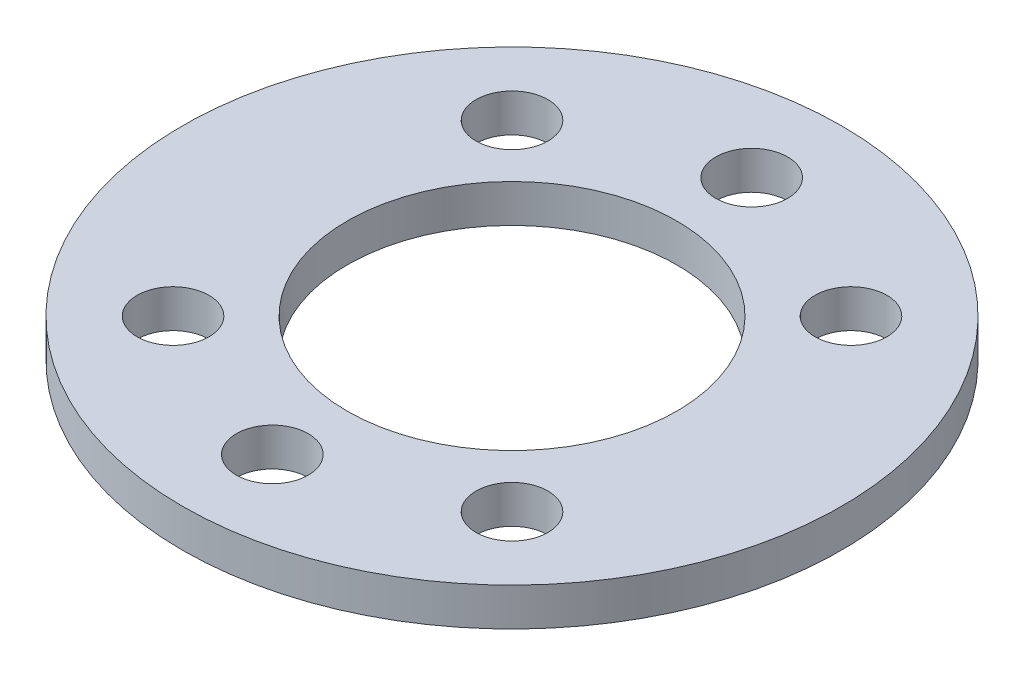
ISO-10303-21;
HEADER;
FILE_DESCRIPTION(('STEP AP214'),'2;1');
FILE_NAME('part.step','',(''),(''),'','','');
FILE_SCHEMA(('AUTOMOTIVE_DESIGN { 1 0 10303 214 1 1 1 1 }'));
ENDSEC;
DATA;
#1=APPLICATION_CONTEXT('core data for automotive mechanical design processes');
#2=APPLICATION_PROTOCOL_DEFINITION('international standard','automotive_design',2000,#1);
#3=PRODUCT_CONTEXT('',#1,'mechanical');
#4=PRODUCT('Part','Part','',(#3));
#5=PRODUCT_RELATED_PRODUCT_CATEGORY('part','',(#4));
#6=PRODUCT_DEFINITION_FORMATION('','',#4);
#7=PRODUCT_DEFINITION_CONTEXT('part definition',#1,'design');
#8=PRODUCT_DEFINITION('design','',#6,#7);
#9=PRODUCT_DEFINITION_SHAPE('','',#8);
#10=(LENGTH_UNIT() NAMED_UNIT(*) SI_UNIT(.MILLI.,.METRE.));
#11=(NAMED_UNIT(*) PLANE_ANGLE_UNIT() SI_UNIT($,.RADIAN.));
#12=(NAMED_UNIT(*) SI_UNIT($,.STERADIAN.) SOLID_ANGLE_UNIT());
#13=UNCERTAINTY_MEASURE_WITH_UNIT(LENGTH_MEASURE(1.E-05),#10,'distance_accuracy_value','');
#14=(GEOMETRIC_REPRESENTATION_CONTEXT(3) GLOBAL_UNCERTAINTY_ASSIGNED_CONTEXT((#13)) GLOBAL_UNIT_ASSIGNED_CONTEXT((#10,
#11,#12)) REPRESENTATION_CONTEXT('',''));
#15=CARTESIAN_POINT('',(0.,0.,0.));
#16=DIRECTION('',(0.,0.,1.));
#17=DIRECTION('',(1.,0.,0.));
#18=AXIS2_PLACEMENT_3D('',#15,#16,#17);
#19=CARTESIAN_POINT('',(0.,2.54,0.));
#20=DIRECTION('',(0.,-1.,0.));
#21=DIRECTION('',(0.,0.,-1.));
#22=AXIS2_PLACEMENT_3D('',#19,#20,#21);
#23=CYLINDRICAL_SURFACE('',#22,11.);
#24=CARTESIAN_POINT('',(0.,2.54,0.));
#25=DIRECTION('',(0.,1.,0.));
#26=DIRECTION('',(0.,0.,1.));
#27=AXIS2_PLACEMENT_3D('',#24,#25,#26);
#28=CIRCLE('',#27,11.);
#29=CARTESIAN_POINT('',(0.,2.54,11.));
#30=VERTEX_POINT('',#29);
#31=EDGE_CURVE('E47',#30,#30,#28,.T.);
#32=ORIENTED_EDGE('',*,*,#31,.T.);
#33=EDGE_LOOP('',(#32));
#34=FACE_BOUND('',#33,.T.);
#35=CARTESIAN_POINT('',(0.,0.,0.));
#36=DIRECTION('',(0.,1.,0.));
#37=DIRECTION('',(0.,0.,1.));
#38=AXIS2_PLACEMENT_3D('',#35,#36,#37);
#39=CIRCLE('',#38,11.);
#40=CARTESIAN_POINT('',(0.,0.,11.));
#41=VERTEX_POINT('',#40);
#42=EDGE_CURVE('E57',#41,#41,#39,.T.);
#43=ORIENTED_EDGE('',*,*,#42,.F.);
#44=EDGE_LOOP('',(#43));
#45=FACE_BOUND('',#44,.T.);
#46=ADVANCED_FACE('F39',(#34,#45),#23,.F.);
#47=CARTESIAN_POINT('',(0.,2.54,0.));
#48=DIRECTION('',(0.,-1.,0.));
#49=DIRECTION('',(0.,0.,-1.));
#50=AXIS2_PLACEMENT_3D('',#47,#48,#49);
#51=CYLINDRICAL_SURFACE('',#50,22.);
#52=CARTESIAN_POINT('',(0.,2.54,0.));
#53=DIRECTION('',(0.,1.,0.));
#54=DIRECTION('',(0.,0.,1.));
#55=AXIS2_PLACEMENT_3D('',#52,#53,#54);
#56=CIRCLE('',#55,22.);
#57=CARTESIAN_POINT('',(0.,2.54,22.));
#58=VERTEX_POINT('',#57);
#59=EDGE_CURVE('E10',#58,#58,#56,.T.);
#60=ORIENTED_EDGE('',*,*,#59,.F.);
#61=EDGE_LOOP('',(#60));
#62=FACE_BOUND('',#61,.T.);
#63=CARTESIAN_POINT('',(0.,0.,0.));
#64=DIRECTION('',(0.,1.,0.));
#65=DIRECTION('',(0.,0.,1.));
#66=AXIS2_PLACEMENT_3D('',#63,#64,#65);
#67=CIRCLE('',#66,22.);
#68=CARTESIAN_POINT('',(0.,0.,22.));
#69=VERTEX_POINT('',#68);
#70=EDGE_CURVE('E53',#69,#69,#67,.T.);
#71=ORIENTED_EDGE('',*,*,#70,.T.);
#72=EDGE_LOOP('',(#71));
#73=FACE_BOUND('',#72,.T.);
#74=ADVANCED_FACE('F105',(#62,#73),#51,.T.);
#75=CARTESIAN_POINT('',(0.,2.54,0.));
#76=DIRECTION('',(0.,1.,0.));
#77=DIRECTION('',(0.,0.,1.));
#78=AXIS2_PLACEMENT_3D('',#75,#76,#77);
#79=PLANE('',#78);
#80=CARTESIAN_POINT('',(-11.3137084989823,2.54,11.3137084989821));
#81=DIRECTION('',(0.,1.,0.));
#82=DIRECTION('',(0.,0.,1.));
#83=AXIS2_PLACEMENT_3D('',#80,#81,#82);
#84=CIRCLE('',#83,2.4000000000032);
#85=CARTESIAN_POINT('',(-11.3137084989823,2.54,13.7137084989853));
#86=VERTEX_POINT('',#85);
#87=EDGE_CURVE('E134',#86,#86,#84,.T.);
#88=ORIENTED_EDGE('',*,*,#87,.F.);
#89=EDGE_LOOP('',(#88));
#90=FACE_BOUND('',#89,.T.);
#91=CARTESIAN_POINT('',(2.44827502489348E-12,2.54,15.9999999999974));
#92=DIRECTION('',(0.,1.,0.));
#93=DIRECTION('',(0.,0.,1.));
#94=AXIS2_PLACEMENT_3D('',#91,#92,#93);
#95=CIRCLE('',#94,2.4000000000032);
#96=CARTESIAN_POINT('',(2.44827502489348E-12,2.54,18.4000000000006));
#97=VERTEX_POINT('',#96);
#98=EDGE_CURVE('E138',#97,#97,#95,.T.);
#99=ORIENTED_EDGE('',*,*,#98,.F.);
#100=EDGE_LOOP('',(#99));
#101=FACE_BOUND('',#100,.T.);
#102=CARTESIAN_POINT('',(11.3137084989873,2.54,11.3137084989823));
#103=DIRECTION('',(0.,1.,0.));
#104=DIRECTION('',(0.,0.,1.));
#105=AXIS2_PLACEMENT_3D('',#102,#103,#104);
#106=CIRCLE('',#105,2.4000000000032);
#107=CARTESIAN_POINT('',(11.3137084989873,2.54,13.7137084989855));
#108=VERTEX_POINT('',#107);
#109=EDGE_CURVE('E142',#108,#108,#106,.T.);
#110=ORIENTED_EDGE('',*,*,#109,.F.);
#111=EDGE_LOOP('',(#110));
#112=FACE_BOUND('',#111,.T.);
#113=CARTESIAN_POINT('',(11.3137084989848,2.54,-11.3137084989847));
#114=DIRECTION('',(0.,1.,0.));
#115=DIRECTION('',(0.,0.,1.));
#116=AXIS2_PLACEMENT_3D('',#113,#114,#115);
#117=CIRCLE('',#116,2.4);
#118=CARTESIAN_POINT('',(11.3137084989848,2.54,-8.91370849898474));
#119=VERTEX_POINT('',#118);
#120=EDGE_CURVE('E146',#119,#119,#117,.T.);
#121=ORIENTED_EDGE('',*,*,#120,.F.);
#122=EDGE_LOOP('',(#121));
#123=FACE_BOUND('',#122,.T.);
#124=CARTESIAN_POINT('',(0.,2.54,-16.));
#125=DIRECTION('',(0.,1.,0.));
#126=DIRECTION('',(0.,0.,1.));
#127=AXIS2_PLACEMENT_3D('',#124,#125,#126);
#128=CIRCLE('',#127,2.4);
#129=CARTESIAN_POINT('',(0.,2.54,-13.6));
#130=VERTEX_POINT('',#129);
#131=EDGE_CURVE('E150',#130,#130,#128,.T.);
#132=ORIENTED_EDGE('',*,*,#131,.F.);
#133=EDGE_LOOP('',(#132));
#134=FACE_BOUND('',#133,.T.);
#135=CARTESIAN_POINT('',(-11.3137084989848,2.54,-11.3137084989847));
#136=DIRECTION('',(0.,1.,0.));
#137=DIRECTION('',(0.,0.,1.));
#138=AXIS2_PLACEMENT_3D('',#135,#136,#137);
#139=CIRCLE('',#138,2.4);
#140=CARTESIAN_POINT('',(-11.3137084989848,2.54,-8.91370849898474));
#141=VERTEX_POINT('',#140);
#142=EDGE_CURVE('E69',#141,#141,#139,.T.);
#143=ORIENTED_EDGE('',*,*,#142,.F.);
#144=EDGE_LOOP('',(#143));
#145=FACE_BOUND('',#144,.T.);
#146=ORIENTED_EDGE('',*,*,#31,.F.);
#147=EDGE_LOOP('',(#146));
#148=FACE_BOUND('',#147,.T.);
#149=ORIENTED_EDGE('',*,*,#59,.T.);
#150=EDGE_LOOP('',(#149));
#151=FACE_BOUND('',#150,.T.);
#152=ADVANCED_FACE('F110',(#90,#101,#112,#123,#134,#145,#148,#151),#79,.T.);
#153=CARTESIAN_POINT('',(0.,0.,0.));
#154=DIRECTION('',(0.,1.,0.));
#155=DIRECTION('',(0.,0.,1.));
#156=AXIS2_PLACEMENT_3D('',#153,#154,#155);
#157=PLANE('',#156);
#158=CARTESIAN_POINT('',(-11.3137084989823,0.,11.3137084989821));
#159=DIRECTION('',(0.,1.,0.));
#160=DIRECTION('',(0.,0.,1.));
#161=AXIS2_PLACEMENT_3D('',#158,#159,#160);
#162=CIRCLE('',#161,2.4000000000032);
#163=CARTESIAN_POINT('',(-11.3137084989823,0.,13.7137084989853));
#164=VERTEX_POINT('',#163);
#165=EDGE_CURVE('E42',#164,#164,#162,.T.);
#166=ORIENTED_EDGE('',*,*,#165,.T.);
#167=EDGE_LOOP('',(#166));
#168=FACE_BOUND('',#167,.T.);
#169=CARTESIAN_POINT('',(2.44827502489348E-12,0.,15.9999999999974));
#170=DIRECTION('',(0.,1.,0.));
#171=DIRECTION('',(0.,0.,1.));
#172=AXIS2_PLACEMENT_3D('',#169,#170,#171);
#173=CIRCLE('',#172,2.4000000000032);
#174=CARTESIAN_POINT('',(2.44827502489348E-12,0.,18.4000000000006));
#175=VERTEX_POINT('',#174);
#176=EDGE_CURVE('E80',#175,#175,#173,.T.);
#177=ORIENTED_EDGE('',*,*,#176,.T.);
#178=EDGE_LOOP('',(#177));
#179=FACE_BOUND('',#178,.T.);
#180=CARTESIAN_POINT('',(11.3137084989873,0.,11.3137084989823));
#181=DIRECTION('',(0.,1.,0.));
#182=DIRECTION('',(0.,0.,1.));
#183=AXIS2_PLACEMENT_3D('',#180,#181,#182);
#184=CIRCLE('',#183,2.4000000000032);
#185=CARTESIAN_POINT('',(11.3137084989873,0.,13.7137084989855));
#186=VERTEX_POINT('',#185);
#187=EDGE_CURVE('E77',#186,#186,#184,.T.);
#188=ORIENTED_EDGE('',*,*,#187,.T.);
#189=EDGE_LOOP('',(#188));
#190=FACE_BOUND('',#189,.T.);
#191=CARTESIAN_POINT('',(11.3137084989848,0.,-11.3137084989847));
#192=DIRECTION('',(0.,1.,0.));
#193=DIRECTION('',(0.,0.,1.));
#194=AXIS2_PLACEMENT_3D('',#191,#192,#193);
#195=CIRCLE('',#194,2.4);
#196=CARTESIAN_POINT('',(11.3137084989848,0.,-8.91370849898474));
#197=VERTEX_POINT('',#196);
#198=EDGE_CURVE('E73',#197,#197,#195,.T.);
#199=ORIENTED_EDGE('',*,*,#198,.T.);
#200=EDGE_LOOP('',(#199));
#201=FACE_BOUND('',#200,.T.);
#202=CARTESIAN_POINT('',(0.,0.,-16.));
#203=DIRECTION('',(0.,1.,0.));
#204=DIRECTION('',(0.,0.,1.));
#205=AXIS2_PLACEMENT_3D('',#202,#203,#204);
#206=CIRCLE('',#205,2.4);
#207=CARTESIAN_POINT('',(0.,0.,-13.6));
#208=VERTEX_POINT('',#207);
#209=EDGE_CURVE('E68',#208,#208,#206,.T.);
#210=ORIENTED_EDGE('',*,*,#209,.T.);
#211=EDGE_LOOP('',(#210));
#212=FACE_BOUND('',#211,.T.);
#213=CARTESIAN_POINT('',(-11.3137084989848,0.,-11.3137084989847));
#214=DIRECTION('',(0.,1.,0.));
#215=DIRECTION('',(0.,0.,1.));
#216=AXIS2_PLACEMENT_3D('',#213,#214,#215);
#217=CIRCLE('',#216,2.4);
#218=CARTESIAN_POINT('',(-11.3137084989848,0.,-8.91370849898474));
#219=VERTEX_POINT('',#218);
#220=EDGE_CURVE('E64',#219,#219,#217,.T.);
#221=ORIENTED_EDGE('',*,*,#220,.T.);
#222=EDGE_LOOP('',(#221));
#223=FACE_BOUND('',#222,.T.);
#224=ORIENTED_EDGE('',*,*,#42,.T.);
#225=EDGE_LOOP('',(#224));
#226=FACE_BOUND('',#225,.T.);
#227=ORIENTED_EDGE('',*,*,#70,.F.);
#228=EDGE_LOOP('',(#227));
#229=FACE_BOUND('',#228,.T.);
#230=ADVANCED_FACE('F89',(#168,#179,#190,#201,#212,#223,#226,#229),#157,.F.);
#231=CARTESIAN_POINT('',(-11.3137084989848,-7.46,-11.3137084989847));
#232=DIRECTION('',(0.,1.,0.));
#233=DIRECTION('',(0.,0.,1.));
#234=AXIS2_PLACEMENT_3D('',#231,#232,#233);
#235=CYLINDRICAL_SURFACE('',#234,2.4);
#236=ORIENTED_EDGE('',*,*,#142,.T.);
#237=EDGE_LOOP('',(#236));
#238=FACE_BOUND('',#237,.T.);
#239=ORIENTED_EDGE('',*,*,#220,.F.);
#240=EDGE_LOOP('',(#239));
#241=FACE_BOUND('',#240,.T.);
#242=ADVANCED_FACE('F118',(#238,#241),#235,.F.);
#243=CARTESIAN_POINT('',(0.,-7.46,-16.));
#244=DIRECTION('',(0.,1.,0.));
#245=DIRECTION('',(0.,0.,1.));
#246=AXIS2_PLACEMENT_3D('',#243,#244,#245);
#247=CYLINDRICAL_SURFACE('',#246,2.4);
#248=ORIENTED_EDGE('',*,*,#131,.T.);
#249=EDGE_LOOP('',(#248));
#250=FACE_BOUND('',#249,.T.);
#251=ORIENTED_EDGE('',*,*,#209,.F.);
#252=EDGE_LOOP('',(#251));
#253=FACE_BOUND('',#252,.T.);
#254=ADVANCED_FACE('F126',(#250,#253),#247,.F.);
#255=CARTESIAN_POINT('',(11.3137084989848,-7.46,-11.3137084989847));
#256=DIRECTION('',(0.,1.,0.));
#257=DIRECTION('',(0.,0.,1.));
#258=AXIS2_PLACEMENT_3D('',#255,#256,#257);
#259=CYLINDRICAL_SURFACE('',#258,2.4);
#260=ORIENTED_EDGE('',*,*,#120,.T.);
#261=EDGE_LOOP('',(#260));
#262=FACE_BOUND('',#261,.T.);
#263=ORIENTED_EDGE('',*,*,#198,.F.);
#264=EDGE_LOOP('',(#263));
#265=FACE_BOUND('',#264,.T.);
#266=ADVANCED_FACE('F166',(#262,#265),#259,.F.);
#267=CARTESIAN_POINT('',(11.3137084989873,-7.46,11.3137084989823));
#268=DIRECTION('',(0.,1.,0.));
#269=DIRECTION('',(0.,0.,1.));
#270=AXIS2_PLACEMENT_3D('',#267,#268,#269);
#271=CYLINDRICAL_SURFACE('',#270,2.4000000000032);
#272=ORIENTED_EDGE('',*,*,#109,.T.);
#273=EDGE_LOOP('',(#272));
#274=FACE_BOUND('',#273,.T.);
#275=ORIENTED_EDGE('',*,*,#187,.F.);
#276=EDGE_LOOP('',(#275));
#277=FACE_BOUND('',#276,.T.);
#278=ADVANCED_FACE('F99',(#274,#277),#271,.F.);
#279=CARTESIAN_POINT('',(2.44827502489348E-12,-7.46,15.9999999999974));
#280=DIRECTION('',(0.,1.,0.));
#281=DIRECTION('',(0.,0.,1.));
#282=AXIS2_PLACEMENT_3D('',#279,#280,#281);
#283=CYLINDRICAL_SURFACE('',#282,2.4000000000032);
#284=ORIENTED_EDGE('',*,*,#98,.T.);
#285=EDGE_LOOP('',(#284));
#286=FACE_BOUND('',#285,.T.);
#287=ORIENTED_EDGE('',*,*,#176,.F.);
#288=EDGE_LOOP('',(#287));
#289=FACE_BOUND('',#288,.T.);
#290=ADVANCED_FACE('F93',(#286,#289),#283,.F.);
#291=CARTESIAN_POINT('',(-11.3137084989823,-7.46,11.3137084989821));
#292=DIRECTION('',(0.,1.,0.));
#293=DIRECTION('',(0.,0.,1.));
#294=AXIS2_PLACEMENT_3D('',#291,#292,#293);
#295=CYLINDRICAL_SURFACE('',#294,2.4000000000032);
#296=ORIENTED_EDGE('',*,*,#87,.T.);
#297=EDGE_LOOP('',(#296));
#298=FACE_BOUND('',#297,.T.);
#299=ORIENTED_EDGE('',*,*,#165,.F.);
#300=EDGE_LOOP('',(#299));
#301=FACE_BOUND('',#300,.T.);
#302=ADVANCED_FACE('F91',(#298,#301),#295,.F.);
#303=CLOSED_SHELL('',(#46,#74,#152,#230,#242,#254,#266,#278,#290,#302));
#304=MANIFOLD_SOLID_BREP('B2',#303);
#305=ADVANCED_BREP_SHAPE_REPRESENTATION('',(#18,#304),#14);
#306=SHAPE_DEFINITION_REPRESENTATION(#9,#305);
ENDSEC;
END-ISO-10303-21;
